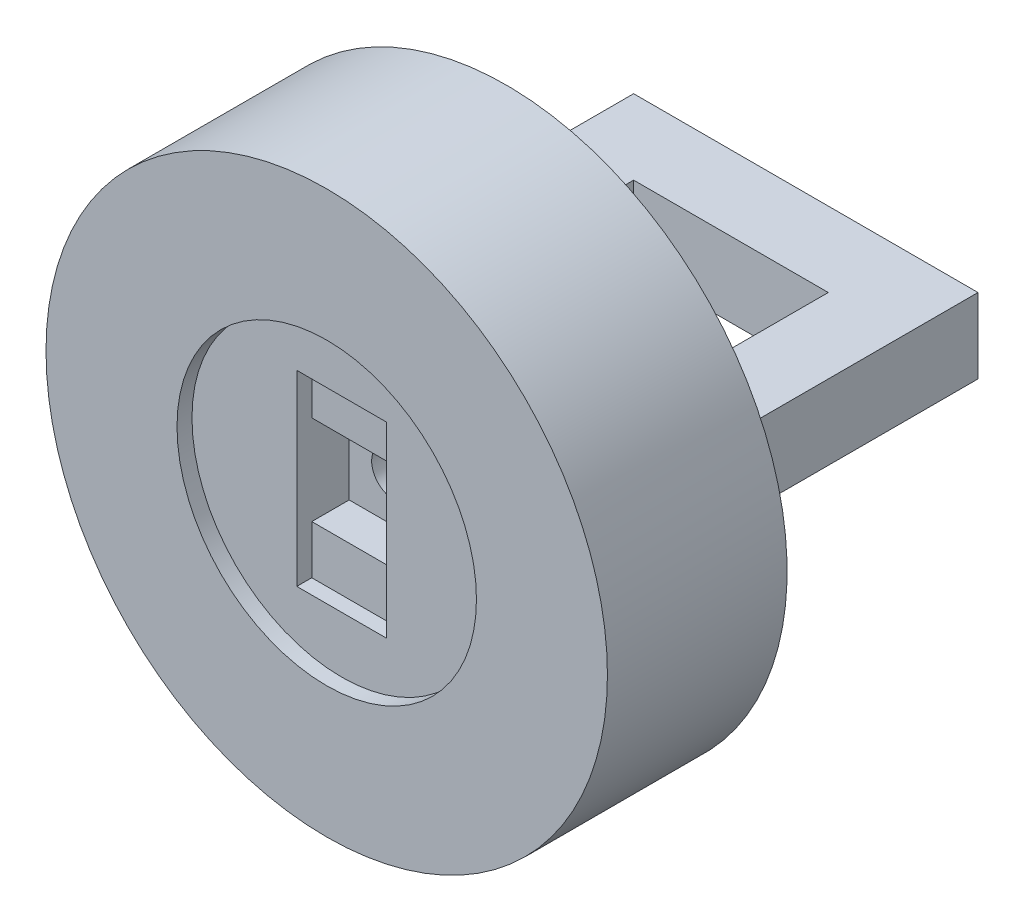
ISO-10303-21;
HEADER;
FILE_DESCRIPTION(('STEP AP214'),'2;1');
FILE_NAME('part.step','',(''),(''),'','','');
FILE_SCHEMA(('AUTOMOTIVE_DESIGN { 1 0 10303 214 1 1 1 1 }'));
ENDSEC;
DATA;
#1=APPLICATION_CONTEXT('core data for automotive mechanical design processes');
#2=APPLICATION_PROTOCOL_DEFINITION('international standard','automotive_design',2000,#1);
#3=PRODUCT_CONTEXT('',#1,'mechanical');
#4=PRODUCT('Part','Part','',(#3));
#5=PRODUCT_RELATED_PRODUCT_CATEGORY('part','',(#4));
#6=PRODUCT_DEFINITION_FORMATION('','',#4);
#7=PRODUCT_DEFINITION_CONTEXT('part definition',#1,'design');
#8=PRODUCT_DEFINITION('design','',#6,#7);
#9=PRODUCT_DEFINITION_SHAPE('','',#8);
#10=(LENGTH_UNIT() NAMED_UNIT(*) SI_UNIT(.MILLI.,.METRE.));
#11=(NAMED_UNIT(*) PLANE_ANGLE_UNIT() SI_UNIT($,.RADIAN.));
#12=(NAMED_UNIT(*) SI_UNIT($,.STERADIAN.) SOLID_ANGLE_UNIT());
#13=UNCERTAINTY_MEASURE_WITH_UNIT(LENGTH_MEASURE(1.E-05),#10,'distance_accuracy_value','');
#14=(GEOMETRIC_REPRESENTATION_CONTEXT(3) GLOBAL_UNCERTAINTY_ASSIGNED_CONTEXT((#13)) GLOBAL_UNIT_ASSIGNED_CONTEXT((#10,
#11,#12)) REPRESENTATION_CONTEXT('',''));
#15=CARTESIAN_POINT('',(0.,0.,0.));
#16=DIRECTION('',(0.,0.,1.));
#17=DIRECTION('',(1.,0.,0.));
#18=AXIS2_PLACEMENT_3D('',#15,#16,#17);
#19=CARTESIAN_POINT('',(0.,0.,-10.));
#20=DIRECTION('',(0.,0.,-1.));
#21=DIRECTION('',(-1.,0.,0.));
#22=AXIS2_PLACEMENT_3D('',#19,#20,#21);
#23=PLANE('',#22);
#24=CARTESIAN_POINT('',(0.,0.,-10.));
#25=DIRECTION('',(0.,0.,-1.));
#26=DIRECTION('',(-1.,0.,0.));
#27=AXIS2_PLACEMENT_3D('',#24,#25,#26);
#28=CIRCLE('',#27,37.5);
#29=CARTESIAN_POINT('',(-37.5,0.,-10.));
#30=VERTEX_POINT('',#29);
#31=EDGE_CURVE('E278',#30,#30,#28,.T.);
#32=ORIENTED_EDGE('',*,*,#31,.T.);
#33=EDGE_LOOP('',(#32));
#34=FACE_BOUND('',#33,.T.);
#35=DIRECTION('',(-1.,0.,0.));
#36=VECTOR('',#35,1.);
#37=CARTESIAN_POINT('',(13.,-5.,-10.));
#38=LINE('',#37,#36);
#39=CARTESIAN_POINT('',(23.,-5.,-10.));
#40=VERTEX_POINT('',#39);
#41=CARTESIAN_POINT('',(13.,-5.,-10.));
#42=VERTEX_POINT('',#41);
#43=EDGE_CURVE('E208',#40,#42,#38,.T.);
#44=ORIENTED_EDGE('',*,*,#43,.F.);
#45=DIRECTION('',(0.,-1.,0.));
#46=VECTOR('',#45,1.);
#47=CARTESIAN_POINT('',(23.,-5.,-10.));
#48=LINE('',#47,#46);
#49=CARTESIAN_POINT('',(23.,5.,-10.));
#50=VERTEX_POINT('',#49);
#51=EDGE_CURVE('E155',#50,#40,#48,.T.);
#52=ORIENTED_EDGE('',*,*,#51,.F.);
#53=DIRECTION('',(1.,0.,0.));
#54=VECTOR('',#53,1.);
#55=CARTESIAN_POINT('',(13.,5.,-10.));
#56=LINE('',#55,#54);
#57=CARTESIAN_POINT('',(13.,5.,-10.));
#58=VERTEX_POINT('',#57);
#59=EDGE_CURVE('E206',#58,#50,#56,.T.);
#60=ORIENTED_EDGE('',*,*,#59,.F.);
#61=DIRECTION('',(0.,1.,0.));
#62=VECTOR('',#61,1.);
#63=CARTESIAN_POINT('',(13.,-5.,-10.));
#64=LINE('',#63,#62);
#65=EDGE_CURVE('E210',#42,#58,#64,.T.);
#66=ORIENTED_EDGE('',*,*,#65,.F.);
#67=EDGE_LOOP('',(#44,#52,#60,#66));
#68=FACE_BOUND('',#67,.T.);
#69=DIRECTION('',(-1.,0.,0.));
#70=VECTOR('',#69,1.);
#71=CARTESIAN_POINT('',(-23.,-5.,-10.));
#72=LINE('',#71,#70);
#73=CARTESIAN_POINT('',(-13.,-5.,-10.));
#74=VERTEX_POINT('',#73);
#75=CARTESIAN_POINT('',(-23.,-5.,-10.));
#76=VERTEX_POINT('',#75);
#77=EDGE_CURVE('E191',#74,#76,#72,.T.);
#78=ORIENTED_EDGE('',*,*,#77,.F.);
#79=DIRECTION('',(0.,-1.,0.));
#80=VECTOR('',#79,1.);
#81=CARTESIAN_POINT('',(-13.,-5.,-10.));
#82=LINE('',#81,#80);
#83=CARTESIAN_POINT('',(-13.,5.,-10.));
#84=VERTEX_POINT('',#83);
#85=EDGE_CURVE('E181',#84,#74,#82,.T.);
#86=ORIENTED_EDGE('',*,*,#85,.F.);
#87=DIRECTION('',(1.,0.,0.));
#88=VECTOR('',#87,1.);
#89=CARTESIAN_POINT('',(-23.,5.,-10.));
#90=LINE('',#89,#88);
#91=CARTESIAN_POINT('',(-23.,5.,-10.));
#92=VERTEX_POINT('',#91);
#93=EDGE_CURVE('E188',#92,#84,#90,.T.);
#94=ORIENTED_EDGE('',*,*,#93,.F.);
#95=DIRECTION('',(0.,1.,0.));
#96=VECTOR('',#95,1.);
#97=CARTESIAN_POINT('',(-23.,-5.,-10.));
#98=LINE('',#97,#96);
#99=EDGE_CURVE('E193',#76,#92,#98,.T.);
#100=ORIENTED_EDGE('',*,*,#99,.F.);
#101=EDGE_LOOP('',(#78,#86,#94,#100));
#102=FACE_BOUND('',#101,.T.);
#103=ADVANCED_FACE('F33',(#34,#68,#102),#23,.T.);
#104=CARTESIAN_POINT('',(0.,0.,12.));
#105=DIRECTION('',(0.,0.,1.));
#106=DIRECTION('',(1.,0.,0.));
#107=AXIS2_PLACEMENT_3D('',#104,#105,#106);
#108=PLANE('',#107);
#109=DIRECTION('',(-1.,0.,0.));
#110=VECTOR('',#109,1.);
#111=CARTESIAN_POINT('',(-6.,12.5,12.));
#112=LINE('',#111,#110);
#113=CARTESIAN_POINT('',(6.,12.5,12.));
#114=VERTEX_POINT('',#113);
#115=CARTESIAN_POINT('',(-6.,12.5,12.));
#116=VERTEX_POINT('',#115);
#117=EDGE_CURVE('E227',#114,#116,#112,.T.);
#118=ORIENTED_EDGE('',*,*,#117,.F.);
#119=DIRECTION('',(0.,1.,0.));
#120=VECTOR('',#119,1.);
#121=CARTESIAN_POINT('',(6.,-12.5,12.));
#122=LINE('',#121,#120);
#123=CARTESIAN_POINT('',(6.,-12.5,12.));
#124=VERTEX_POINT('',#123);
#125=EDGE_CURVE('E225',#124,#114,#122,.T.);
#126=ORIENTED_EDGE('',*,*,#125,.F.);
#127=DIRECTION('',(1.,0.,0.));
#128=VECTOR('',#127,1.);
#129=CARTESIAN_POINT('',(-6.,-12.5,12.));
#130=LINE('',#129,#128);
#131=CARTESIAN_POINT('',(-6.,-12.5,12.));
#132=VERTEX_POINT('',#131);
#133=EDGE_CURVE('E233',#132,#124,#130,.T.);
#134=ORIENTED_EDGE('',*,*,#133,.F.);
#135=DIRECTION('',(0.,-1.,0.));
#136=VECTOR('',#135,1.);
#137=CARTESIAN_POINT('',(-6.,-12.5,12.));
#138=LINE('',#137,#136);
#139=EDGE_CURVE('E230',#116,#132,#138,.T.);
#140=ORIENTED_EDGE('',*,*,#139,.F.);
#141=EDGE_LOOP('',(#118,#126,#134,#140));
#142=FACE_BOUND('',#141,.T.);
#143=CARTESIAN_POINT('',(0.,0.,12.));
#144=DIRECTION('',(0.,0.,1.));
#145=DIRECTION('',(1.,0.,0.));
#146=AXIS2_PLACEMENT_3D('',#143,#144,#145);
#147=CIRCLE('',#146,20.);
#148=CARTESIAN_POINT('',(20.,0.,12.));
#149=VERTEX_POINT('',#148);
#150=EDGE_CURVE('E158',#149,#149,#147,.T.);
#151=ORIENTED_EDGE('',*,*,#150,.T.);
#152=EDGE_LOOP('',(#151));
#153=FACE_BOUND('',#152,.T.);
#154=ADVANCED_FACE('F303',(#142,#153),#108,.T.);
#155=CARTESIAN_POINT('',(0.,0.,10.));
#156=DIRECTION('',(0.,0.,1.));
#157=DIRECTION('',(1.,0.,0.));
#158=AXIS2_PLACEMENT_3D('',#155,#156,#157);
#159=PLANE('',#158);
#160=DIRECTION('',(-1.,0.,0.));
#161=VECTOR('',#160,1.);
#162=CARTESIAN_POINT('',(-6.,6.,10.));
#163=LINE('',#162,#161);
#164=CARTESIAN_POINT('',(6.,6.,10.));
#165=VERTEX_POINT('',#164);
#166=CARTESIAN_POINT('',(-6.,5.99999999999999,10.));
#167=VERTEX_POINT('',#166);
#168=EDGE_CURVE('E252',#165,#167,#163,.T.);
#169=ORIENTED_EDGE('',*,*,#168,.F.);
#170=DIRECTION('',(0.,1.,0.));
#171=VECTOR('',#170,1.);
#172=CARTESIAN_POINT('',(6.,-12.5,10.));
#173=LINE('',#172,#171);
#174=CARTESIAN_POINT('',(6.,12.5,10.));
#175=VERTEX_POINT('',#174);
#176=EDGE_CURVE('E11',#165,#175,#173,.T.);
#177=ORIENTED_EDGE('',*,*,#176,.T.);
#178=DIRECTION('',(-1.,0.,0.));
#179=VECTOR('',#178,1.);
#180=CARTESIAN_POINT('',(-6.,12.5,10.));
#181=LINE('',#180,#179);
#182=CARTESIAN_POINT('',(-6.,12.5,10.));
#183=VERTEX_POINT('',#182);
#184=EDGE_CURVE('E236',#175,#183,#181,.T.);
#185=ORIENTED_EDGE('',*,*,#184,.T.);
#186=DIRECTION('',(0.,-1.,0.));
#187=VECTOR('',#186,1.);
#188=CARTESIAN_POINT('',(-6.,-12.5,10.));
#189=LINE('',#188,#187);
#190=EDGE_CURVE('E239',#183,#167,#189,.T.);
#191=ORIENTED_EDGE('',*,*,#190,.T.);
#192=EDGE_LOOP('',(#169,#177,#185,#191));
#193=FACE_BOUND('',#192,.T.);
#194=ADVANCED_FACE('F311',(#193),#159,.T.);
#195=DIRECTION('',(1.,0.,0.));
#196=VECTOR('',#195,1.);
#197=CARTESIAN_POINT('',(-6.,-12.5,10.));
#198=LINE('',#197,#196);
#199=CARTESIAN_POINT('',(-6.,-12.5,10.));
#200=VERTEX_POINT('',#199);
#201=CARTESIAN_POINT('',(6.,-12.5,10.));
#202=VERTEX_POINT('',#201);
#203=EDGE_CURVE('E228',#200,#202,#198,.T.);
#204=ORIENTED_EDGE('',*,*,#203,.T.);
#205=CARTESIAN_POINT('',(6.,-6.,10.));
#206=VERTEX_POINT('',#205);
#207=EDGE_CURVE('E44',#202,#206,#173,.T.);
#208=ORIENTED_EDGE('',*,*,#207,.T.);
#209=DIRECTION('',(1.,0.,0.));
#210=VECTOR('',#209,1.);
#211=CARTESIAN_POINT('',(-6.,-6.,10.));
#212=LINE('',#211,#210);
#213=CARTESIAN_POINT('',(-6.,-6.,10.));
#214=VERTEX_POINT('',#213);
#215=EDGE_CURVE('E255',#214,#206,#212,.T.);
#216=ORIENTED_EDGE('',*,*,#215,.F.);
#217=EDGE_CURVE('E42',#214,#200,#189,.T.);
#218=ORIENTED_EDGE('',*,*,#217,.T.);
#219=EDGE_LOOP('',(#204,#208,#216,#218));
#220=FACE_BOUND('',#219,.T.);
#221=ADVANCED_FACE('F300',(#220),#159,.T.);
#222=CARTESIAN_POINT('',(0.,0.,5.));
#223=DIRECTION('',(0.,0.,1.));
#224=DIRECTION('',(1.,0.,0.));
#225=AXIS2_PLACEMENT_3D('',#222,#223,#224);
#226=PLANE('',#225);
#227=CARTESIAN_POINT('',(0.,0.,5.));
#228=DIRECTION('',(0.,0.,1.));
#229=DIRECTION('',(1.,0.,0.));
#230=AXIS2_PLACEMENT_3D('',#227,#228,#229);
#231=CIRCLE('',#230,3.);
#232=CARTESIAN_POINT('',(3.,0.,5.));
#233=VERTEX_POINT('',#232);
#234=EDGE_CURVE('E280',#233,#233,#231,.T.);
#235=ORIENTED_EDGE('',*,*,#234,.F.);
#236=EDGE_LOOP('',(#235));
#237=FACE_BOUND('',#236,.T.);
#238=DIRECTION('',(1.,0.,0.));
#239=VECTOR('',#238,1.);
#240=CARTESIAN_POINT('',(-6.,-6.,5.));
#241=LINE('',#240,#239);
#242=CARTESIAN_POINT('',(-6.,-6.,5.));
#243=VERTEX_POINT('',#242);
#244=CARTESIAN_POINT('',(6.,-6.,5.));
#245=VERTEX_POINT('',#244);
#246=EDGE_CURVE('E256',#243,#245,#241,.T.);
#247=ORIENTED_EDGE('',*,*,#246,.T.);
#248=DIRECTION('',(0.,1.,0.));
#249=VECTOR('',#248,1.);
#250=CARTESIAN_POINT('',(6.,-6.,5.));
#251=LINE('',#250,#249);
#252=CARTESIAN_POINT('',(6.,6.,5.));
#253=VERTEX_POINT('',#252);
#254=EDGE_CURVE('E251',#245,#253,#251,.T.);
#255=ORIENTED_EDGE('',*,*,#254,.T.);
#256=DIRECTION('',(-1.,0.,0.));
#257=VECTOR('',#256,1.);
#258=CARTESIAN_POINT('',(-6.,6.,5.));
#259=LINE('',#258,#257);
#260=CARTESIAN_POINT('',(-6.,6.,5.));
#261=VERTEX_POINT('',#260);
#262=EDGE_CURVE('E262',#253,#261,#259,.T.);
#263=ORIENTED_EDGE('',*,*,#262,.T.);
#264=DIRECTION('',(0.,-1.,0.));
#265=VECTOR('',#264,1.);
#266=CARTESIAN_POINT('',(-6.,-6.,5.));
#267=LINE('',#266,#265);
#268=EDGE_CURVE('E265',#261,#243,#267,.T.);
#269=ORIENTED_EDGE('',*,*,#268,.T.);
#270=EDGE_LOOP('',(#247,#255,#263,#269));
#271=FACE_BOUND('',#270,.T.);
#272=ADVANCED_FACE('F292',(#237,#271),#226,.T.);
#273=CARTESIAN_POINT('',(0.,0.,5.));
#274=DIRECTION('',(0.,0.,-1.));
#275=DIRECTION('',(-1.,0.,0.));
#276=AXIS2_PLACEMENT_3D('',#273,#274,#275);
#277=CYLINDRICAL_SURFACE('',#276,3.);
#278=ORIENTED_EDGE('',*,*,#234,.T.);
#279=EDGE_LOOP('',(#278));
#280=FACE_BOUND('',#279,.T.);
#281=CARTESIAN_POINT('',(0.,0.,0.));
#282=DIRECTION('',(0.,0.,1.));
#283=DIRECTION('',(1.,0.,0.));
#284=AXIS2_PLACEMENT_3D('',#281,#282,#283);
#285=CIRCLE('',#284,3.);
#286=CARTESIAN_POINT('',(3.,0.,0.));
#287=VERTEX_POINT('',#286);
#288=EDGE_CURVE('E37',#287,#287,#285,.T.);
#289=ORIENTED_EDGE('',*,*,#288,.F.);
#290=EDGE_LOOP('',(#289));
#291=FACE_BOUND('',#290,.T.);
#292=ADVANCED_FACE('F290',(#280,#291),#277,.F.);
#293=CARTESIAN_POINT('',(0.,0.,0.));
#294=DIRECTION('',(0.,0.,-1.));
#295=DIRECTION('',(-1.,0.,0.));
#296=AXIS2_PLACEMENT_3D('',#293,#294,#295);
#297=PLANE('',#296);
#298=ORIENTED_EDGE('',*,*,#288,.T.);
#299=EDGE_LOOP('',(#298));
#300=FACE_BOUND('',#299,.T.);
#301=ADVANCED_FACE('F288',(#300),#297,.F.);
#302=CARTESIAN_POINT('',(6.,-6.,10.));
#303=DIRECTION('',(-1.,0.,0.));
#304=DIRECTION('',(0.,0.,1.));
#305=AXIS2_PLACEMENT_3D('',#302,#303,#304);
#306=PLANE('',#305);
#307=ORIENTED_EDGE('',*,*,#254,.F.);
#308=DIRECTION('',(0.,0.,-1.));
#309=VECTOR('',#308,1.);
#310=CARTESIAN_POINT('',(6.,-6.,10.));
#311=LINE('',#310,#309);
#312=EDGE_CURVE('E259',#206,#245,#311,.T.);
#313=ORIENTED_EDGE('',*,*,#312,.F.);
#314=ORIENTED_EDGE('',*,*,#207,.F.);
#315=DIRECTION('',(0.,0.,-1.));
#316=VECTOR('',#315,1.);
#317=CARTESIAN_POINT('',(6.,-12.5,12.));
#318=LINE('',#317,#316);
#319=EDGE_CURVE('E234',#124,#202,#318,.T.);
#320=ORIENTED_EDGE('',*,*,#319,.F.);
#321=ORIENTED_EDGE('',*,*,#125,.T.);
#322=DIRECTION('',(0.,0.,-1.));
#323=VECTOR('',#322,1.);
#324=CARTESIAN_POINT('',(6.,12.5,12.));
#325=LINE('',#324,#323);
#326=EDGE_CURVE('E248',#114,#175,#325,.T.);
#327=ORIENTED_EDGE('',*,*,#326,.T.);
#328=ORIENTED_EDGE('',*,*,#176,.F.);
#329=DIRECTION('',(0.,0.,-1.));
#330=VECTOR('',#329,1.);
#331=CARTESIAN_POINT('',(6.,6.,10.));
#332=LINE('',#331,#330);
#333=EDGE_CURVE('E275',#165,#253,#332,.T.);
#334=ORIENTED_EDGE('',*,*,#333,.T.);
#335=EDGE_LOOP('',(#307,#313,#314,#320,#321,#327,#328,#334));
#336=FACE_BOUND('',#335,.T.);
#337=ADVANCED_FACE('F298',(#336),#306,.T.);
#338=CARTESIAN_POINT('',(-6.,6.,10.));
#339=DIRECTION('',(0.,-1.,0.));
#340=DIRECTION('',(0.,0.,-1.));
#341=AXIS2_PLACEMENT_3D('',#338,#339,#340);
#342=PLANE('',#341);
#343=ORIENTED_EDGE('',*,*,#262,.F.);
#344=ORIENTED_EDGE('',*,*,#333,.F.);
#345=ORIENTED_EDGE('',*,*,#168,.T.);
#346=DIRECTION('',(0.,0.,-1.));
#347=VECTOR('',#346,1.);
#348=CARTESIAN_POINT('',(-6.,6.,10.));
#349=LINE('',#348,#347);
#350=EDGE_CURVE('E273',#167,#261,#349,.T.);
#351=ORIENTED_EDGE('',*,*,#350,.T.);
#352=EDGE_LOOP('',(#343,#344,#345,#351));
#353=FACE_BOUND('',#352,.T.);
#354=ADVANCED_FACE('F321',(#353),#342,.T.);
#355=CARTESIAN_POINT('',(-6.,-6.,10.));
#356=DIRECTION('',(1.,0.,0.));
#357=DIRECTION('',(0.,0.,-1.));
#358=AXIS2_PLACEMENT_3D('',#355,#356,#357);
#359=PLANE('',#358);
#360=ORIENTED_EDGE('',*,*,#268,.F.);
#361=ORIENTED_EDGE('',*,*,#350,.F.);
#362=ORIENTED_EDGE('',*,*,#190,.F.);
#363=DIRECTION('',(0.,0.,-1.));
#364=VECTOR('',#363,1.);
#365=CARTESIAN_POINT('',(-6.,12.5,12.));
#366=LINE('',#365,#364);
#367=EDGE_CURVE('E246',#116,#183,#366,.T.);
#368=ORIENTED_EDGE('',*,*,#367,.F.);
#369=ORIENTED_EDGE('',*,*,#139,.T.);
#370=DIRECTION('',(0.,0.,-1.));
#371=VECTOR('',#370,1.);
#372=CARTESIAN_POINT('',(-6.,-12.5,12.));
#373=LINE('',#372,#371);
#374=EDGE_CURVE('E244',#132,#200,#373,.T.);
#375=ORIENTED_EDGE('',*,*,#374,.T.);
#376=ORIENTED_EDGE('',*,*,#217,.F.);
#377=DIRECTION('',(0.,0.,-1.));
#378=VECTOR('',#377,1.);
#379=CARTESIAN_POINT('',(-6.,-6.,10.));
#380=LINE('',#379,#378);
#381=EDGE_CURVE('E271',#214,#243,#380,.T.);
#382=ORIENTED_EDGE('',*,*,#381,.T.);
#383=EDGE_LOOP('',(#360,#361,#362,#368,#369,#375,#376,#382));
#384=FACE_BOUND('',#383,.T.);
#385=ADVANCED_FACE('F325',(#384),#359,.T.);
#386=CARTESIAN_POINT('',(-6.,-6.,10.));
#387=DIRECTION('',(0.,1.,0.));
#388=DIRECTION('',(0.,0.,1.));
#389=AXIS2_PLACEMENT_3D('',#386,#387,#388);
#390=PLANE('',#389);
#391=ORIENTED_EDGE('',*,*,#246,.F.);
#392=ORIENTED_EDGE('',*,*,#381,.F.);
#393=ORIENTED_EDGE('',*,*,#215,.T.);
#394=ORIENTED_EDGE('',*,*,#312,.T.);
#395=EDGE_LOOP('',(#391,#392,#393,#394));
#396=FACE_BOUND('',#395,.T.);
#397=ADVANCED_FACE('F329',(#396),#390,.T.);
#398=CARTESIAN_POINT('',(-6.,12.5,12.));
#399=DIRECTION('',(0.,-1.,0.));
#400=DIRECTION('',(1.,0.,0.));
#401=AXIS2_PLACEMENT_3D('',#398,#399,#400);
#402=PLANE('',#401);
#403=ORIENTED_EDGE('',*,*,#184,.F.);
#404=ORIENTED_EDGE('',*,*,#326,.F.);
#405=ORIENTED_EDGE('',*,*,#117,.T.);
#406=ORIENTED_EDGE('',*,*,#367,.T.);
#407=EDGE_LOOP('',(#403,#404,#405,#406));
#408=FACE_BOUND('',#407,.T.);
#409=ADVANCED_FACE('F332',(#408),#402,.T.);
#410=CARTESIAN_POINT('',(-6.,-12.5,12.));
#411=DIRECTION('',(0.,1.,0.));
#412=DIRECTION('',(-1.,0.,0.));
#413=AXIS2_PLACEMENT_3D('',#410,#411,#412);
#414=PLANE('',#413);
#415=ORIENTED_EDGE('',*,*,#203,.F.);
#416=ORIENTED_EDGE('',*,*,#374,.F.);
#417=ORIENTED_EDGE('',*,*,#133,.T.);
#418=ORIENTED_EDGE('',*,*,#319,.T.);
#419=EDGE_LOOP('',(#415,#416,#417,#418));
#420=FACE_BOUND('',#419,.T.);
#421=ADVANCED_FACE('F337',(#420),#414,.T.);
#422=CARTESIAN_POINT('',(0.,0.,14.));
#423=DIRECTION('',(0.,0.,1.));
#424=DIRECTION('',(1.,0.,0.));
#425=AXIS2_PLACEMENT_3D('',#422,#423,#424);
#426=PLANE('',#425);
#427=CARTESIAN_POINT('',(0.,0.,14.));
#428=DIRECTION('',(0.,0.,1.));
#429=DIRECTION('',(1.,0.,0.));
#430=AXIS2_PLACEMENT_3D('',#427,#428,#429);
#431=CIRCLE('',#430,37.5);
#432=CARTESIAN_POINT('',(37.5,0.,14.));
#433=VERTEX_POINT('',#432);
#434=EDGE_CURVE('E220',#433,#433,#431,.T.);
#435=ORIENTED_EDGE('',*,*,#434,.T.);
#436=EDGE_LOOP('',(#435));
#437=FACE_BOUND('',#436,.T.);
#438=CARTESIAN_POINT('',(0.,0.,14.));
#439=DIRECTION('',(0.,0.,1.));
#440=DIRECTION('',(1.,0.,0.));
#441=AXIS2_PLACEMENT_3D('',#438,#439,#440);
#442=CIRCLE('',#441,20.);
#443=CARTESIAN_POINT('',(20.,0.,14.));
#444=VERTEX_POINT('',#443);
#445=EDGE_CURVE('E217',#444,#444,#442,.T.);
#446=ORIENTED_EDGE('',*,*,#445,.F.);
#447=EDGE_LOOP('',(#446));
#448=FACE_BOUND('',#447,.T.);
#449=ADVANCED_FACE('F341',(#437,#448),#426,.T.);
#450=CARTESIAN_POINT('',(0.,0.,14.));
#451=DIRECTION('',(0.,0.,-1.));
#452=DIRECTION('',(-1.,0.,0.));
#453=AXIS2_PLACEMENT_3D('',#450,#451,#452);
#454=CYLINDRICAL_SURFACE('',#453,20.);
#455=ORIENTED_EDGE('',*,*,#445,.T.);
#456=EDGE_LOOP('',(#455));
#457=FACE_BOUND('',#456,.T.);
#458=ORIENTED_EDGE('',*,*,#150,.F.);
#459=EDGE_LOOP('',(#458));
#460=FACE_BOUND('',#459,.T.);
#461=ADVANCED_FACE('F345',(#457,#460),#454,.F.);
#462=CARTESIAN_POINT('',(0.,0.,5.));
#463=DIRECTION('',(0.,0.,-1.));
#464=DIRECTION('',(-1.,0.,0.));
#465=AXIS2_PLACEMENT_3D('',#462,#463,#464);
#466=CYLINDRICAL_SURFACE('',#465,37.5);
#467=ORIENTED_EDGE('',*,*,#31,.F.);
#468=EDGE_LOOP('',(#467));
#469=FACE_BOUND('',#468,.T.);
#470=ORIENTED_EDGE('',*,*,#434,.F.);
#471=EDGE_LOOP('',(#470));
#472=FACE_BOUND('',#471,.T.);
#473=ADVANCED_FACE('F35',(#469,#472),#466,.T.);
#474=CARTESIAN_POINT('',(23.,-5.,-40.));
#475=DIRECTION('',(-1.,0.,0.));
#476=DIRECTION('',(0.,0.,1.));
#477=AXIS2_PLACEMENT_3D('',#474,#475,#476);
#478=PLANE('',#477);
#479=ORIENTED_EDGE('',*,*,#51,.T.);
#480=DIRECTION('',(0.,0.,1.));
#481=VECTOR('',#480,1.);
#482=CARTESIAN_POINT('',(23.,-5.,-40.));
#483=LINE('',#482,#481);
#484=CARTESIAN_POINT('',(23.,-5.,-50.));
#485=VERTEX_POINT('',#484);
#486=EDGE_CURVE('E148',#485,#40,#483,.T.);
#487=ORIENTED_EDGE('',*,*,#486,.F.);
#488=DIRECTION('',(0.,-1.,0.));
#489=VECTOR('',#488,1.);
#490=CARTESIAN_POINT('',(23.,-5.,-50.));
#491=LINE('',#490,#489);
#492=CARTESIAN_POINT('',(23.,5.,-50.));
#493=VERTEX_POINT('',#492);
#494=EDGE_CURVE('E153',#493,#485,#491,.T.);
#495=ORIENTED_EDGE('',*,*,#494,.F.);
#496=DIRECTION('',(0.,0.,1.));
#497=VECTOR('',#496,1.);
#498=CARTESIAN_POINT('',(23.,5.,-40.));
#499=LINE('',#498,#497);
#500=EDGE_CURVE('E205',#493,#50,#499,.T.);
#501=ORIENTED_EDGE('',*,*,#500,.T.);
#502=EDGE_LOOP('',(#479,#487,#495,#501));
#503=FACE_BOUND('',#502,.T.);
#504=ADVANCED_FACE('F150',(#503),#478,.F.);
#505=CARTESIAN_POINT('',(13.,-5.,-40.));
#506=DIRECTION('',(0.,1.,0.));
#507=DIRECTION('',(0.,0.,1.));
#508=AXIS2_PLACEMENT_3D('',#505,#506,#507);
#509=PLANE('',#508);
#510=ORIENTED_EDGE('',*,*,#43,.T.);
#511=DIRECTION('',(0.,0.,1.));
#512=VECTOR('',#511,1.);
#513=CARTESIAN_POINT('',(13.,-5.,-40.));
#514=LINE('',#513,#512);
#515=CARTESIAN_POINT('',(13.,-5.,-40.));
#516=VERTEX_POINT('',#515);
#517=EDGE_CURVE('E159',#516,#42,#514,.T.);
#518=ORIENTED_EDGE('',*,*,#517,.F.);
#519=DIRECTION('',(-1.,0.,0.));
#520=VECTOR('',#519,1.);
#521=CARTESIAN_POINT('',(23.,-5.,-40.));
#522=LINE('',#521,#520);
#523=CARTESIAN_POINT('',(-13.,-5.,-40.));
#524=VERTEX_POINT('',#523);
#525=EDGE_CURVE('E176',#516,#524,#522,.T.);
#526=ORIENTED_EDGE('',*,*,#525,.T.);
#527=DIRECTION('',(0.,0.,1.));
#528=VECTOR('',#527,1.);
#529=CARTESIAN_POINT('',(-13.,-5.,-40.));
#530=LINE('',#529,#528);
#531=EDGE_CURVE('E200',#524,#74,#530,.T.);
#532=ORIENTED_EDGE('',*,*,#531,.T.);
#533=ORIENTED_EDGE('',*,*,#77,.T.);
#534=DIRECTION('',(0.,0.,1.));
#535=VECTOR('',#534,1.);
#536=CARTESIAN_POINT('',(-23.,-5.,-40.));
#537=LINE('',#536,#535);
#538=CARTESIAN_POINT('',(-23.,-5.,-50.));
#539=VERTEX_POINT('',#538);
#540=EDGE_CURVE('E165',#539,#76,#537,.T.);
#541=ORIENTED_EDGE('',*,*,#540,.F.);
#542=DIRECTION('',(-1.,0.,0.));
#543=VECTOR('',#542,1.);
#544=CARTESIAN_POINT('',(23.,-5.,-50.));
#545=LINE('',#544,#543);
#546=EDGE_CURVE('E162',#485,#539,#545,.T.);
#547=ORIENTED_EDGE('',*,*,#546,.F.);
#548=ORIENTED_EDGE('',*,*,#486,.T.);
#549=EDGE_LOOP('',(#510,#518,#526,#532,#533,#541,#547,#548));
#550=FACE_BOUND('',#549,.T.);
#551=ADVANCED_FACE('F163',(#550),#509,.F.);
#552=CARTESIAN_POINT('',(13.,-5.,-40.));
#553=DIRECTION('',(1.,0.,0.));
#554=DIRECTION('',(0.,0.,-1.));
#555=AXIS2_PLACEMENT_3D('',#552,#553,#554);
#556=PLANE('',#555);
#557=ORIENTED_EDGE('',*,*,#65,.T.);
#558=DIRECTION('',(0.,0.,1.));
#559=VECTOR('',#558,1.);
#560=CARTESIAN_POINT('',(13.,5.,-40.));
#561=LINE('',#560,#559);
#562=CARTESIAN_POINT('',(13.,5.,-40.));
#563=VERTEX_POINT('',#562);
#564=EDGE_CURVE('E58',#563,#58,#561,.T.);
#565=ORIENTED_EDGE('',*,*,#564,.F.);
#566=DIRECTION('',(0.,1.,0.));
#567=VECTOR('',#566,1.);
#568=CARTESIAN_POINT('',(13.,-5.,-40.));
#569=LINE('',#568,#567);
#570=EDGE_CURVE('E202',#516,#563,#569,.T.);
#571=ORIENTED_EDGE('',*,*,#570,.F.);
#572=ORIENTED_EDGE('',*,*,#517,.T.);
#573=EDGE_LOOP('',(#557,#565,#571,#572));
#574=FACE_BOUND('',#573,.T.);
#575=ADVANCED_FACE('F354',(#574),#556,.F.);
#576=CARTESIAN_POINT('',(13.,5.,-40.));
#577=DIRECTION('',(0.,-1.,0.));
#578=DIRECTION('',(1.,0.,0.));
#579=AXIS2_PLACEMENT_3D('',#576,#577,#578);
#580=PLANE('',#579);
#581=ORIENTED_EDGE('',*,*,#59,.T.);
#582=ORIENTED_EDGE('',*,*,#500,.F.);
#583=DIRECTION('',(1.,0.,0.));
#584=VECTOR('',#583,1.);
#585=CARTESIAN_POINT('',(23.,5.,-50.));
#586=LINE('',#585,#584);
#587=CARTESIAN_POINT('',(-23.,5.,-50.));
#588=VERTEX_POINT('',#587);
#589=EDGE_CURVE('E173',#588,#493,#586,.T.);
#590=ORIENTED_EDGE('',*,*,#589,.F.);
#591=DIRECTION('',(0.,0.,1.));
#592=VECTOR('',#591,1.);
#593=CARTESIAN_POINT('',(-23.,5.,-40.));
#594=LINE('',#593,#592);
#595=EDGE_CURVE('E51',#588,#92,#594,.T.);
#596=ORIENTED_EDGE('',*,*,#595,.T.);
#597=ORIENTED_EDGE('',*,*,#93,.T.);
#598=DIRECTION('',(0.,0.,1.));
#599=VECTOR('',#598,1.);
#600=CARTESIAN_POINT('',(-13.,5.,-40.));
#601=LINE('',#600,#599);
#602=CARTESIAN_POINT('',(-13.,5.,-40.));
#603=VERTEX_POINT('',#602);
#604=EDGE_CURVE('E187',#603,#84,#601,.T.);
#605=ORIENTED_EDGE('',*,*,#604,.F.);
#606=DIRECTION('',(1.,0.,0.));
#607=VECTOR('',#606,1.);
#608=CARTESIAN_POINT('',(23.,5.,-40.));
#609=LINE('',#608,#607);
#610=EDGE_CURVE('E174',#603,#563,#609,.T.);
#611=ORIENTED_EDGE('',*,*,#610,.T.);
#612=ORIENTED_EDGE('',*,*,#564,.T.);
#613=EDGE_LOOP('',(#581,#582,#590,#596,#597,#605,#611,#612));
#614=FACE_BOUND('',#613,.T.);
#615=ADVANCED_FACE('F357',(#614),#580,.F.);
#616=CARTESIAN_POINT('',(-13.,-5.,-40.));
#617=DIRECTION('',(-1.,0.,0.));
#618=DIRECTION('',(0.,0.,1.));
#619=AXIS2_PLACEMENT_3D('',#616,#617,#618);
#620=PLANE('',#619);
#621=ORIENTED_EDGE('',*,*,#85,.T.);
#622=ORIENTED_EDGE('',*,*,#531,.F.);
#623=DIRECTION('',(0.,-1.,0.));
#624=VECTOR('',#623,1.);
#625=CARTESIAN_POINT('',(-13.,-5.,-40.));
#626=LINE('',#625,#624);
#627=EDGE_CURVE('E184',#603,#524,#626,.T.);
#628=ORIENTED_EDGE('',*,*,#627,.F.);
#629=ORIENTED_EDGE('',*,*,#604,.T.);
#630=EDGE_LOOP('',(#621,#622,#628,#629));
#631=FACE_BOUND('',#630,.T.);
#632=ADVANCED_FACE('F361',(#631),#620,.F.);
#633=CARTESIAN_POINT('',(-23.,-5.,-40.));
#634=DIRECTION('',(1.,0.,0.));
#635=DIRECTION('',(0.,0.,-1.));
#636=AXIS2_PLACEMENT_3D('',#633,#634,#635);
#637=PLANE('',#636);
#638=ORIENTED_EDGE('',*,*,#99,.T.);
#639=ORIENTED_EDGE('',*,*,#595,.F.);
#640=DIRECTION('',(0.,1.,0.));
#641=VECTOR('',#640,1.);
#642=CARTESIAN_POINT('',(-23.,-5.,-50.));
#643=LINE('',#642,#641);
#644=EDGE_CURVE('E169',#539,#588,#643,.T.);
#645=ORIENTED_EDGE('',*,*,#644,.F.);
#646=ORIENTED_EDGE('',*,*,#540,.T.);
#647=EDGE_LOOP('',(#638,#639,#645,#646));
#648=FACE_BOUND('',#647,.T.);
#649=ADVANCED_FACE('F364',(#648),#637,.F.);
#650=CARTESIAN_POINT('',(0.,0.,-50.));
#651=DIRECTION('',(0.,0.,1.));
#652=DIRECTION('',(1.,0.,0.));
#653=AXIS2_PLACEMENT_3D('',#650,#651,#652);
#654=PLANE('',#653);
#655=ORIENTED_EDGE('',*,*,#494,.T.);
#656=ORIENTED_EDGE('',*,*,#546,.T.);
#657=ORIENTED_EDGE('',*,*,#644,.T.);
#658=ORIENTED_EDGE('',*,*,#589,.T.);
#659=EDGE_LOOP('',(#655,#656,#657,#658));
#660=FACE_BOUND('',#659,.T.);
#661=ADVANCED_FACE('F172',(#660),#654,.F.);
#662=CARTESIAN_POINT('',(0.,0.,-40.));
#663=DIRECTION('',(0.,0.,1.));
#664=DIRECTION('',(1.,0.,0.));
#665=AXIS2_PLACEMENT_3D('',#662,#663,#664);
#666=PLANE('',#665);
#667=ORIENTED_EDGE('',*,*,#525,.F.);
#668=ORIENTED_EDGE('',*,*,#570,.T.);
#669=ORIENTED_EDGE('',*,*,#610,.F.);
#670=ORIENTED_EDGE('',*,*,#627,.T.);
#671=EDGE_LOOP('',(#667,#668,#669,#670));
#672=FACE_BOUND('',#671,.T.);
#673=ADVANCED_FACE('F369',(#672),#666,.T.);
#674=CLOSED_SHELL('',(#103,#154,#194,#221,#272,#292,#301,#337,#354,#385,#397,#409,#421,#449,
#461,#473,#504,#551,#575,#615,#632,#649,#661,#673));
#675=MANIFOLD_SOLID_BREP('B2',#674);
#676=ADVANCED_BREP_SHAPE_REPRESENTATION('',(#18,#675),#14);
#677=SHAPE_DEFINITION_REPRESENTATION(#9,#676);
ENDSEC;
END-ISO-10303-21;
